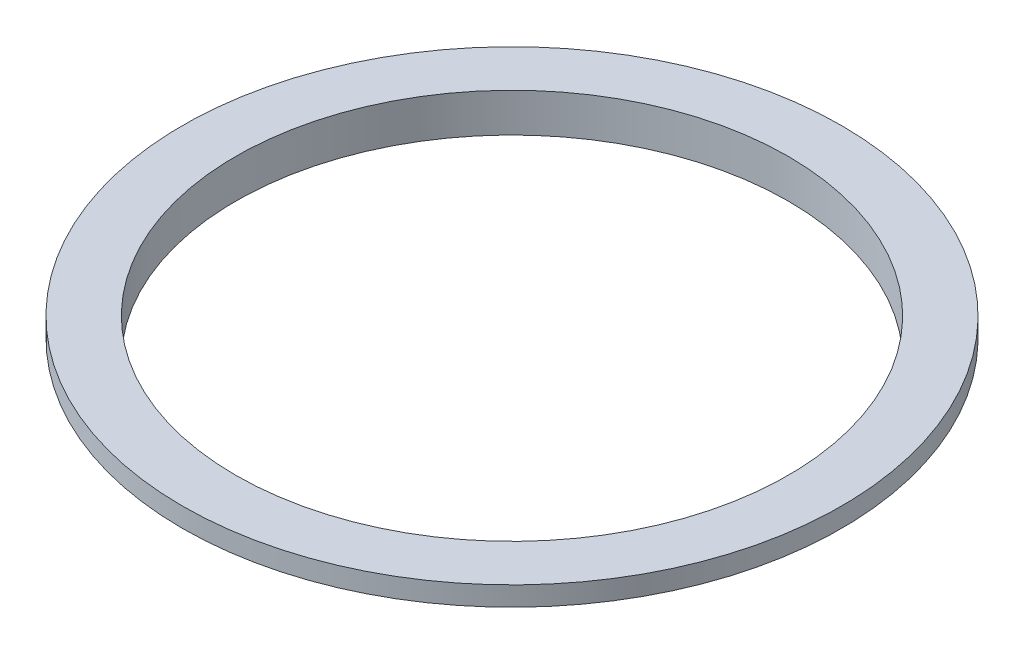
ISO-10303-21;
HEADER;
FILE_DESCRIPTION(('STEP AP214'),'2;1');
FILE_NAME('part.step','',(''),(''),'','','');
FILE_SCHEMA(('AUTOMOTIVE_DESIGN { 1 0 10303 214 1 1 1 1 }'));
ENDSEC;
DATA;
#1=APPLICATION_CONTEXT('core data for automotive mechanical design processes');
#2=APPLICATION_PROTOCOL_DEFINITION('international standard','automotive_design',2000,#1);
#3=PRODUCT_CONTEXT('',#1,'mechanical');
#4=PRODUCT('Part','Part','',(#3));
#5=PRODUCT_RELATED_PRODUCT_CATEGORY('part','',(#4));
#6=PRODUCT_DEFINITION_FORMATION('','',#4);
#7=PRODUCT_DEFINITION_CONTEXT('part definition',#1,'design');
#8=PRODUCT_DEFINITION('design','',#6,#7);
#9=PRODUCT_DEFINITION_SHAPE('','',#8);
#10=(LENGTH_UNIT() NAMED_UNIT(*) SI_UNIT(.MILLI.,.METRE.));
#11=(NAMED_UNIT(*) PLANE_ANGLE_UNIT() SI_UNIT($,.RADIAN.));
#12=(NAMED_UNIT(*) SI_UNIT($,.STERADIAN.) SOLID_ANGLE_UNIT());
#13=UNCERTAINTY_MEASURE_WITH_UNIT(LENGTH_MEASURE(1.E-05),#10,'distance_accuracy_value','');
#14=(GEOMETRIC_REPRESENTATION_CONTEXT(3) GLOBAL_UNCERTAINTY_ASSIGNED_CONTEXT((#13)) GLOBAL_UNIT_ASSIGNED_CONTEXT((#10,
#11,#12)) REPRESENTATION_CONTEXT('',''));
#15=CARTESIAN_POINT('',(0.,0.,0.));
#16=DIRECTION('',(0.,0.,1.));
#17=DIRECTION('',(1.,0.,0.));
#18=AXIS2_PLACEMENT_3D('',#15,#16,#17);
#19=CARTESIAN_POINT('',(0.,0.,0.));
#20=DIRECTION('',(0.,1.,0.));
#21=DIRECTION('',(0.,0.,1.));
#22=AXIS2_PLACEMENT_3D('',#19,#20,#21);
#23=PLANE('',#22);
#24=CARTESIAN_POINT('',(0.,0.,0.));
#25=DIRECTION('',(0.,1.,0.));
#26=DIRECTION('',(0.,0.,1.));
#27=AXIS2_PLACEMENT_3D('',#24,#25,#26);
#28=CIRCLE('',#27,31.);
#29=CARTESIAN_POINT('',(0.,0.,31.));
#30=VERTEX_POINT('',#29);
#31=EDGE_CURVE('E45',#30,#30,#28,.T.);
#32=ORIENTED_EDGE('',*,*,#31,.F.);
#33=EDGE_LOOP('',(#32));
#34=FACE_BOUND('',#33,.T.);
#35=CARTESIAN_POINT('',(0.,0.,0.));
#36=DIRECTION('',(0.,1.,0.));
#37=DIRECTION('',(0.,0.,1.));
#38=AXIS2_PLACEMENT_3D('',#35,#36,#37);
#39=CIRCLE('',#38,28.5);
#40=CARTESIAN_POINT('',(0.,0.,28.5));
#41=VERTEX_POINT('',#40);
#42=EDGE_CURVE('E54',#41,#41,#39,.T.);
#43=ORIENTED_EDGE('',*,*,#42,.T.);
#44=EDGE_LOOP('',(#43));
#45=FACE_BOUND('',#44,.T.);
#46=ADVANCED_FACE('F41',(#34,#45),#23,.F.);
#47=CARTESIAN_POINT('',(0.,2.,0.));
#48=DIRECTION('',(0.,-1.,0.));
#49=DIRECTION('',(0.,0.,-1.));
#50=AXIS2_PLACEMENT_3D('',#47,#48,#49);
#51=CYLINDRICAL_SURFACE('',#50,31.);
#52=CARTESIAN_POINT('',(0.,2.,0.));
#53=DIRECTION('',(0.,1.,0.));
#54=DIRECTION('',(0.,0.,1.));
#55=AXIS2_PLACEMENT_3D('',#52,#53,#54);
#56=CIRCLE('',#55,31.);
#57=CARTESIAN_POINT('',(0.,2.,31.));
#58=VERTEX_POINT('',#57);
#59=EDGE_CURVE('E10',#58,#58,#56,.T.);
#60=ORIENTED_EDGE('',*,*,#59,.F.);
#61=EDGE_LOOP('',(#60));
#62=FACE_BOUND('',#61,.T.);
#63=ORIENTED_EDGE('',*,*,#31,.T.);
#64=EDGE_LOOP('',(#63));
#65=FACE_BOUND('',#64,.T.);
#66=ADVANCED_FACE('F43',(#62,#65),#51,.T.);
#67=CARTESIAN_POINT('',(0.,2.,0.));
#68=DIRECTION('',(0.,-1.,0.));
#69=DIRECTION('',(0.,0.,-1.));
#70=AXIS2_PLACEMENT_3D('',#67,#68,#69);
#71=CYLINDRICAL_SURFACE('',#70,28.5);
#72=ORIENTED_EDGE('',*,*,#42,.F.);
#73=EDGE_LOOP('',(#72));
#74=FACE_BOUND('',#73,.T.);
#75=CARTESIAN_POINT('',(0.,4.,0.));
#76=DIRECTION('',(0.,1.,0.));
#77=DIRECTION('',(0.,0.,1.));
#78=AXIS2_PLACEMENT_3D('',#75,#76,#77);
#79=CIRCLE('',#78,28.5);
#80=CARTESIAN_POINT('',(0.,4.,28.5));
#81=VERTEX_POINT('',#80);
#82=EDGE_CURVE('E64',#81,#81,#79,.T.);
#83=ORIENTED_EDGE('',*,*,#82,.T.);
#84=EDGE_LOOP('',(#83));
#85=FACE_BOUND('',#84,.T.);
#86=ADVANCED_FACE('F72',(#74,#85),#71,.F.);
#87=CARTESIAN_POINT('',(0.,4.,0.));
#88=DIRECTION('',(0.,1.,0.));
#89=DIRECTION('',(0.,0.,1.));
#90=AXIS2_PLACEMENT_3D('',#87,#88,#89);
#91=PLANE('',#90);
#92=CARTESIAN_POINT('',(0.,4.,0.));
#93=DIRECTION('',(0.,1.,0.));
#94=DIRECTION('',(0.,0.,1.));
#95=AXIS2_PLACEMENT_3D('',#92,#93,#94);
#96=CIRCLE('',#95,34.);
#97=CARTESIAN_POINT('',(0.,4.,34.));
#98=VERTEX_POINT('',#97);
#99=EDGE_CURVE('E59',#98,#98,#96,.T.);
#100=ORIENTED_EDGE('',*,*,#99,.T.);
#101=EDGE_LOOP('',(#100));
#102=FACE_BOUND('',#101,.T.);
#103=ORIENTED_EDGE('',*,*,#82,.F.);
#104=EDGE_LOOP('',(#103));
#105=FACE_BOUND('',#104,.T.);
#106=ADVANCED_FACE('F74',(#102,#105),#91,.T.);
#107=CARTESIAN_POINT('',(0.,2.,0.));
#108=DIRECTION('',(0.,1.,0.));
#109=DIRECTION('',(0.,0.,1.));
#110=AXIS2_PLACEMENT_3D('',#107,#108,#109);
#111=PLANE('',#110);
#112=ORIENTED_EDGE('',*,*,#59,.T.);
#113=EDGE_LOOP('',(#112));
#114=FACE_BOUND('',#113,.T.);
#115=CARTESIAN_POINT('',(0.,2.,0.));
#116=DIRECTION('',(0.,1.,0.));
#117=DIRECTION('',(0.,0.,1.));
#118=AXIS2_PLACEMENT_3D('',#115,#116,#117);
#119=CIRCLE('',#118,34.);
#120=CARTESIAN_POINT('',(0.,2.,34.));
#121=VERTEX_POINT('',#120);
#122=EDGE_CURVE('E60',#121,#121,#119,.T.);
#123=ORIENTED_EDGE('',*,*,#122,.F.);
#124=EDGE_LOOP('',(#123));
#125=FACE_BOUND('',#124,.T.);
#126=ADVANCED_FACE('F76',(#114,#125),#111,.F.);
#127=CARTESIAN_POINT('',(0.,4.,0.));
#128=DIRECTION('',(0.,-1.,0.));
#129=DIRECTION('',(0.,0.,-1.));
#130=AXIS2_PLACEMENT_3D('',#127,#128,#129);
#131=CYLINDRICAL_SURFACE('',#130,34.);
#132=ORIENTED_EDGE('',*,*,#99,.F.);
#133=EDGE_LOOP('',(#132));
#134=FACE_BOUND('',#133,.T.);
#135=ORIENTED_EDGE('',*,*,#122,.T.);
#136=EDGE_LOOP('',(#135));
#137=FACE_BOUND('',#136,.T.);
#138=ADVANCED_FACE('F83',(#134,#137),#131,.T.);
#139=CLOSED_SHELL('',(#46,#66,#86,#106,#126,#138));
#140=MANIFOLD_SOLID_BREP('B2',#139);
#141=ADVANCED_BREP_SHAPE_REPRESENTATION('',(#18,#140),#14);
#142=SHAPE_DEFINITION_REPRESENTATION(#9,#141);
ENDSEC;
END-ISO-10303-21;
